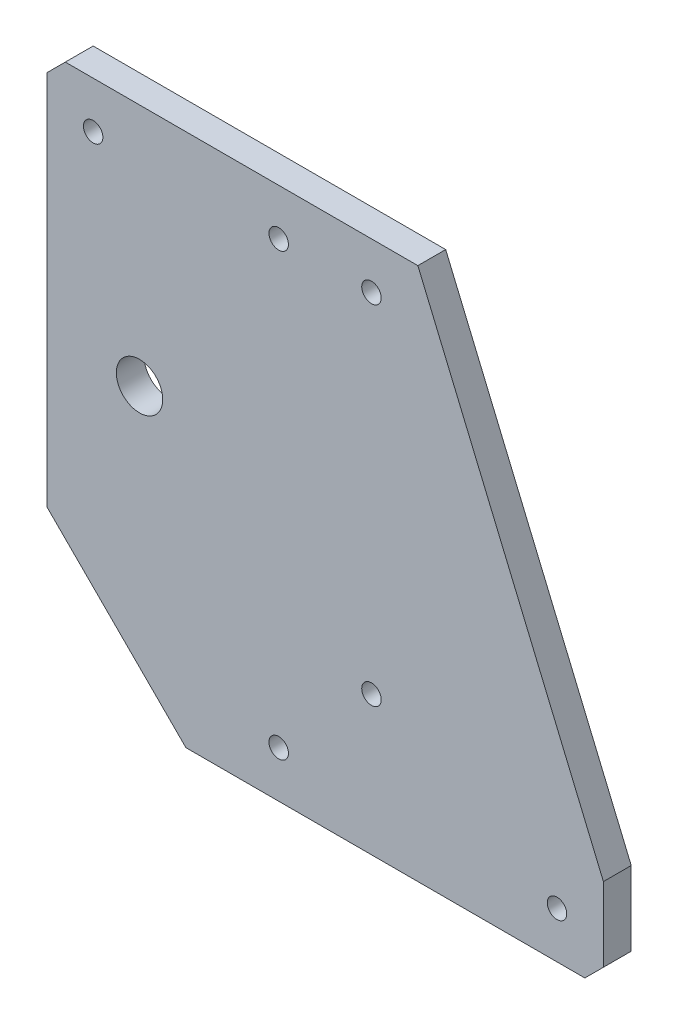
ISO-10303-21;
HEADER;
FILE_DESCRIPTION(('STEP AP214'),'2;1');
FILE_NAME('part.step','',(''),(''),'','','');
FILE_SCHEMA(('AUTOMOTIVE_DESIGN { 1 0 10303 214 1 1 1 1 }'));
ENDSEC;
DATA;
#1=APPLICATION_CONTEXT('core data for automotive mechanical design processes');
#2=APPLICATION_PROTOCOL_DEFINITION('international standard','automotive_design',2000,#1);
#3=PRODUCT_CONTEXT('',#1,'mechanical');
#4=PRODUCT('Part','Part','',(#3));
#5=PRODUCT_RELATED_PRODUCT_CATEGORY('part','',(#4));
#6=PRODUCT_DEFINITION_FORMATION('','',#4);
#7=PRODUCT_DEFINITION_CONTEXT('part definition',#1,'design');
#8=PRODUCT_DEFINITION('design','',#6,#7);
#9=PRODUCT_DEFINITION_SHAPE('','',#8);
#10=(LENGTH_UNIT() NAMED_UNIT(*) SI_UNIT(.MILLI.,.METRE.));
#11=(NAMED_UNIT(*) PLANE_ANGLE_UNIT() SI_UNIT($,.RADIAN.));
#12=(NAMED_UNIT(*) SI_UNIT($,.STERADIAN.) SOLID_ANGLE_UNIT());
#13=UNCERTAINTY_MEASURE_WITH_UNIT(LENGTH_MEASURE(1.E-05),#10,'distance_accuracy_value','');
#14=(GEOMETRIC_REPRESENTATION_CONTEXT(3) GLOBAL_UNCERTAINTY_ASSIGNED_CONTEXT((#13)) GLOBAL_UNIT_ASSIGNED_CONTEXT((#10,
#11,#12)) REPRESENTATION_CONTEXT('',''));
#15=CARTESIAN_POINT('',(0.,0.,0.));
#16=DIRECTION('',(0.,0.,1.));
#17=DIRECTION('',(1.,0.,0.));
#18=AXIS2_PLACEMENT_3D('',#15,#16,#17);
#19=CARTESIAN_POINT('',(0.,0.,3.));
#20=DIRECTION('',(0.,0.,1.));
#21=DIRECTION('',(1.,0.,0.));
#22=AXIS2_PLACEMENT_3D('',#19,#20,#21);
#23=PLANE('',#22);
#24=CARTESIAN_POINT('',(-10.,42.5,3.));
#25=DIRECTION('',(0.,0.,1.));
#26=DIRECTION('',(1.,0.,0.));
#27=AXIS2_PLACEMENT_3D('',#24,#25,#26);
#28=CIRCLE('',#27,2.1);
#29=CARTESIAN_POINT('',(-7.90000000000001,42.5,3.));
#30=VERTEX_POINT('',#29);
#31=EDGE_CURVE('E222',#30,#30,#28,.T.);
#32=ORIENTED_EDGE('',*,*,#31,.F.);
#33=EDGE_LOOP('',(#32));
#34=FACE_BOUND('',#33,.T.);
#35=CARTESIAN_POINT('',(30.,42.5,3.));
#36=DIRECTION('',(0.,0.,1.));
#37=DIRECTION('',(1.,0.,0.));
#38=AXIS2_PLACEMENT_3D('',#35,#36,#37);
#39=CIRCLE('',#38,2.1);
#40=CARTESIAN_POINT('',(32.1,42.5,3.));
#41=VERTEX_POINT('',#40);
#42=EDGE_CURVE('E305',#41,#41,#39,.T.);
#43=ORIENTED_EDGE('',*,*,#42,.F.);
#44=EDGE_LOOP('',(#43));
#45=FACE_BOUND('',#44,.T.);
#46=CARTESIAN_POINT('',(50.,42.5,3.));
#47=DIRECTION('',(0.,0.,1.));
#48=DIRECTION('',(1.,0.,0.));
#49=AXIS2_PLACEMENT_3D('',#46,#47,#48);
#50=CIRCLE('',#49,2.1);
#51=CARTESIAN_POINT('',(52.1,42.5,3.));
#52=VERTEX_POINT('',#51);
#53=EDGE_CURVE('E310',#52,#52,#50,.T.);
#54=ORIENTED_EDGE('',*,*,#53,.F.);
#55=EDGE_LOOP('',(#54));
#56=FACE_BOUND('',#55,.T.);
#57=CARTESIAN_POINT('',(50.,-32.5,3.));
#58=DIRECTION('',(0.,0.,1.));
#59=DIRECTION('',(1.,0.,0.));
#60=AXIS2_PLACEMENT_3D('',#57,#58,#59);
#61=CIRCLE('',#60,2.1);
#62=CARTESIAN_POINT('',(52.1,-32.5,3.));
#63=VERTEX_POINT('',#62);
#64=EDGE_CURVE('E313',#63,#63,#61,.T.);
#65=ORIENTED_EDGE('',*,*,#64,.F.);
#66=EDGE_LOOP('',(#65));
#67=FACE_BOUND('',#66,.T.);
#68=CARTESIAN_POINT('',(30.,-52.5,3.));
#69=DIRECTION('',(0.,0.,1.));
#70=DIRECTION('',(1.,0.,0.));
#71=AXIS2_PLACEMENT_3D('',#68,#69,#70);
#72=CIRCLE('',#71,2.1);
#73=CARTESIAN_POINT('',(32.1,-52.5,3.));
#74=VERTEX_POINT('',#73);
#75=EDGE_CURVE('E316',#74,#74,#72,.T.);
#76=ORIENTED_EDGE('',*,*,#75,.F.);
#77=EDGE_LOOP('',(#76));
#78=FACE_BOUND('',#77,.T.);
#79=CARTESIAN_POINT('',(90.,-52.5,3.));
#80=DIRECTION('',(0.,0.,1.));
#81=DIRECTION('',(1.,0.,0.));
#82=AXIS2_PLACEMENT_3D('',#79,#80,#81);
#83=CIRCLE('',#82,2.1);
#84=CARTESIAN_POINT('',(92.1,-52.5,3.));
#85=VERTEX_POINT('',#84);
#86=EDGE_CURVE('E318',#85,#85,#83,.T.);
#87=ORIENTED_EDGE('',*,*,#86,.F.);
#88=EDGE_LOOP('',(#87));
#89=FACE_BOUND('',#88,.T.);
#90=DIRECTION('',(-1.,0.,0.));
#91=VECTOR('',#90,1.);
#92=CARTESIAN_POINT('',(60.,52.5,3.));
#93=LINE('',#92,#91);
#94=CARTESIAN_POINT('',(60.,52.5,3.));
#95=VERTEX_POINT('',#94);
#96=CARTESIAN_POINT('',(-16.,52.5,3.));
#97=VERTEX_POINT('',#96);
#98=EDGE_CURVE('E141',#95,#97,#93,.T.);
#99=ORIENTED_EDGE('',*,*,#98,.T.);
#100=DIRECTION('',(0.707106781186548,0.707106781186548,0.));
#101=VECTOR('',#100,1.);
#102=CARTESIAN_POINT('',(-34.25,34.25,3.));
#103=LINE('',#102,#101);
#104=CARTESIAN_POINT('',(-20.,48.5,3.));
#105=VERTEX_POINT('',#104);
#106=EDGE_CURVE('E163',#97,#105,#103,.F.);
#107=ORIENTED_EDGE('',*,*,#106,.T.);
#108=DIRECTION('',(0.,-1.,0.));
#109=VECTOR('',#108,1.);
#110=CARTESIAN_POINT('',(-20.,52.5,3.));
#111=LINE('',#110,#109);
#112=CARTESIAN_POINT('',(-20.,-32.4999999999999,3.));
#113=VERTEX_POINT('',#112);
#114=EDGE_CURVE('E227',#105,#113,#111,.T.);
#115=ORIENTED_EDGE('',*,*,#114,.T.);
#116=DIRECTION('',(-0.707106781186547,0.707106781186548,0.));
#117=VECTOR('',#116,1.);
#118=CARTESIAN_POINT('',(-26.25,-26.2499999999999,3.));
#119=LINE('',#118,#117);
#120=CARTESIAN_POINT('',(10.,-62.5,3.));
#121=VERTEX_POINT('',#120);
#122=EDGE_CURVE('E151',#113,#121,#119,.F.);
#123=ORIENTED_EDGE('',*,*,#122,.T.);
#124=DIRECTION('',(1.,0.,0.));
#125=VECTOR('',#124,1.);
#126=CARTESIAN_POINT('',(-20.,-62.5,3.));
#127=LINE('',#126,#125);
#128=CARTESIAN_POINT('',(96.,-62.5,3.));
#129=VERTEX_POINT('',#128);
#130=EDGE_CURVE('E112',#121,#129,#127,.T.);
#131=ORIENTED_EDGE('',*,*,#130,.T.);
#132=DIRECTION('',(-0.707106781186548,-0.707106781186548,0.));
#133=VECTOR('',#132,1.);
#134=CARTESIAN_POINT('',(79.25,-79.25,3.));
#135=LINE('',#134,#133);
#136=CARTESIAN_POINT('',(100.,-58.5,3.));
#137=VERTEX_POINT('',#136);
#138=EDGE_CURVE('E53',#129,#137,#135,.F.);
#139=ORIENTED_EDGE('',*,*,#138,.T.);
#140=DIRECTION('',(0.,1.,0.));
#141=VECTOR('',#140,1.);
#142=CARTESIAN_POINT('',(100.,-62.5,3.));
#143=LINE('',#142,#141);
#144=CARTESIAN_POINT('',(100.,-42.5,3.));
#145=VERTEX_POINT('',#144);
#146=EDGE_CURVE('E102',#137,#145,#143,.T.);
#147=ORIENTED_EDGE('',*,*,#146,.T.);
#148=DIRECTION('',(-0.388057000058133,0.921635375138065,0.));
#149=VECTOR('',#148,1.);
#150=CARTESIAN_POINT('',(100.,-42.5,3.));
#151=LINE('',#150,#149);
#152=EDGE_CURVE('E107',#145,#95,#151,.T.);
#153=ORIENTED_EDGE('',*,*,#152,.T.);
#154=EDGE_LOOP('',(#99,#107,#115,#123,#131,#139,#147,#153));
#155=FACE_BOUND('',#154,.T.);
#156=CARTESIAN_POINT('',(0.,0.,3.));
#157=DIRECTION('',(0.,0.,1.));
#158=DIRECTION('',(1.,0.,0.));
#159=AXIS2_PLACEMENT_3D('',#156,#157,#158);
#160=CIRCLE('',#159,5.00000000000001);
#161=CARTESIAN_POINT('',(5.00000000000001,0.,3.));
#162=VERTEX_POINT('',#161);
#163=EDGE_CURVE('E135',#162,#162,#160,.T.);
#164=ORIENTED_EDGE('',*,*,#163,.F.);
#165=EDGE_LOOP('',(#164));
#166=FACE_BOUND('',#165,.T.);
#167=ADVANCED_FACE('F37',(#34,#45,#56,#67,#78,#89,#155,#166),#23,.T.);
#168=CARTESIAN_POINT('',(0.,0.,-3.));
#169=DIRECTION('',(0.,0.,1.));
#170=DIRECTION('',(1.,0.,0.));
#171=AXIS2_PLACEMENT_3D('',#168,#169,#170);
#172=PLANE('',#171);
#173=CARTESIAN_POINT('',(90.,-52.5,-3.));
#174=DIRECTION('',(0.,0.,1.));
#175=DIRECTION('',(1.,0.,0.));
#176=AXIS2_PLACEMENT_3D('',#173,#174,#175);
#177=CIRCLE('',#176,4.09999999999999);
#178=CARTESIAN_POINT('',(94.1,-52.5,-3.));
#179=VERTEX_POINT('',#178);
#180=EDGE_CURVE('E177',#179,#179,#177,.T.);
#181=ORIENTED_EDGE('',*,*,#180,.T.);
#182=EDGE_LOOP('',(#181));
#183=FACE_BOUND('',#182,.T.);
#184=CARTESIAN_POINT('',(30.,-52.5,-3.));
#185=DIRECTION('',(0.,0.,1.));
#186=DIRECTION('',(1.,0.,0.));
#187=AXIS2_PLACEMENT_3D('',#184,#185,#186);
#188=CIRCLE('',#187,4.10000000000001);
#189=CARTESIAN_POINT('',(34.1,-52.5,-3.));
#190=VERTEX_POINT('',#189);
#191=EDGE_CURVE('E174',#190,#190,#188,.T.);
#192=ORIENTED_EDGE('',*,*,#191,.T.);
#193=EDGE_LOOP('',(#192));
#194=FACE_BOUND('',#193,.T.);
#195=CARTESIAN_POINT('',(50.,-32.5,-3.));
#196=DIRECTION('',(0.,0.,1.));
#197=DIRECTION('',(1.,0.,0.));
#198=AXIS2_PLACEMENT_3D('',#195,#196,#197);
#199=CIRCLE('',#198,4.09999999999998);
#200=CARTESIAN_POINT('',(54.1,-32.5,-3.));
#201=VERTEX_POINT('',#200);
#202=EDGE_CURVE('E171',#201,#201,#199,.T.);
#203=ORIENTED_EDGE('',*,*,#202,.T.);
#204=EDGE_LOOP('',(#203));
#205=FACE_BOUND('',#204,.T.);
#206=CARTESIAN_POINT('',(50.,42.5,-3.));
#207=DIRECTION('',(0.,0.,1.));
#208=DIRECTION('',(1.,0.,0.));
#209=AXIS2_PLACEMENT_3D('',#206,#207,#208);
#210=CIRCLE('',#209,4.09999999999998);
#211=CARTESIAN_POINT('',(54.1,42.5,-3.));
#212=VERTEX_POINT('',#211);
#213=EDGE_CURVE('E168',#212,#212,#210,.T.);
#214=ORIENTED_EDGE('',*,*,#213,.T.);
#215=EDGE_LOOP('',(#214));
#216=FACE_BOUND('',#215,.T.);
#217=CARTESIAN_POINT('',(-10.,42.5,-3.));
#218=DIRECTION('',(0.,0.,1.));
#219=DIRECTION('',(1.,0.,0.));
#220=AXIS2_PLACEMENT_3D('',#217,#218,#219);
#221=CIRCLE('',#220,2.1);
#222=CARTESIAN_POINT('',(-7.90000000000001,42.5,-3.));
#223=VERTEX_POINT('',#222);
#224=EDGE_CURVE('E208',#223,#223,#221,.T.);
#225=ORIENTED_EDGE('',*,*,#224,.T.);
#226=EDGE_LOOP('',(#225));
#227=FACE_BOUND('',#226,.T.);
#228=CARTESIAN_POINT('',(30.,42.5,-3.));
#229=DIRECTION('',(0.,0.,1.));
#230=DIRECTION('',(1.,0.,0.));
#231=AXIS2_PLACEMENT_3D('',#228,#229,#230);
#232=CIRCLE('',#231,2.1);
#233=CARTESIAN_POINT('',(32.1,42.5,-3.));
#234=VERTEX_POINT('',#233);
#235=EDGE_CURVE('E212',#234,#234,#232,.T.);
#236=ORIENTED_EDGE('',*,*,#235,.T.);
#237=EDGE_LOOP('',(#236));
#238=FACE_BOUND('',#237,.T.);
#239=DIRECTION('',(0.,-1.,0.));
#240=VECTOR('',#239,1.);
#241=CARTESIAN_POINT('',(-20.,52.5,-3.));
#242=LINE('',#241,#240);
#243=CARTESIAN_POINT('',(-20.,48.5,-3.));
#244=VERTEX_POINT('',#243);
#245=CARTESIAN_POINT('',(-20.,-32.4999999999999,-3.));
#246=VERTEX_POINT('',#245);
#247=EDGE_CURVE('E134',#244,#246,#242,.T.);
#248=ORIENTED_EDGE('',*,*,#247,.F.);
#249=DIRECTION('',(-0.707106781186548,-0.707106781186548,0.));
#250=VECTOR('',#249,1.);
#251=CARTESIAN_POINT('',(-20.,48.5,-3.));
#252=LINE('',#251,#250);
#253=CARTESIAN_POINT('',(-16.,52.5,-3.));
#254=VERTEX_POINT('',#253);
#255=EDGE_CURVE('E158',#244,#254,#252,.F.);
#256=ORIENTED_EDGE('',*,*,#255,.T.);
#257=DIRECTION('',(-1.,0.,0.));
#258=VECTOR('',#257,1.);
#259=CARTESIAN_POINT('',(60.,52.5,-3.));
#260=LINE('',#259,#258);
#261=CARTESIAN_POINT('',(60.,52.5,-3.));
#262=VERTEX_POINT('',#261);
#263=EDGE_CURVE('E131',#262,#254,#260,.T.);
#264=ORIENTED_EDGE('',*,*,#263,.F.);
#265=DIRECTION('',(-0.388057000058133,0.921635375138065,0.));
#266=VECTOR('',#265,1.);
#267=CARTESIAN_POINT('',(100.,-42.5,-3.));
#268=LINE('',#267,#266);
#269=CARTESIAN_POINT('',(100.,-42.5,-3.));
#270=VERTEX_POINT('',#269);
#271=EDGE_CURVE('E140',#270,#262,#268,.T.);
#272=ORIENTED_EDGE('',*,*,#271,.F.);
#273=DIRECTION('',(0.,1.,0.));
#274=VECTOR('',#273,1.);
#275=CARTESIAN_POINT('',(100.,-62.5,-3.));
#276=LINE('',#275,#274);
#277=CARTESIAN_POINT('',(100.,-58.5,-3.));
#278=VERTEX_POINT('',#277);
#279=EDGE_CURVE('E118',#278,#270,#276,.T.);
#280=ORIENTED_EDGE('',*,*,#279,.F.);
#281=DIRECTION('',(0.707106781186548,0.707106781186548,0.));
#282=VECTOR('',#281,1.);
#283=CARTESIAN_POINT('',(100.,-58.5,-3.));
#284=LINE('',#283,#282);
#285=CARTESIAN_POINT('',(96.,-62.5,-3.));
#286=VERTEX_POINT('',#285);
#287=EDGE_CURVE('E156',#278,#286,#284,.F.);
#288=ORIENTED_EDGE('',*,*,#287,.T.);
#289=DIRECTION('',(1.,0.,0.));
#290=VECTOR('',#289,1.);
#291=CARTESIAN_POINT('',(-20.,-62.5,-3.));
#292=LINE('',#291,#290);
#293=CARTESIAN_POINT('',(10.,-62.5,-3.));
#294=VERTEX_POINT('',#293);
#295=EDGE_CURVE('E137',#294,#286,#292,.T.);
#296=ORIENTED_EDGE('',*,*,#295,.F.);
#297=DIRECTION('',(0.707106781186547,-0.707106781186548,0.));
#298=VECTOR('',#297,1.);
#299=CARTESIAN_POINT('',(10.,-62.5,-3.));
#300=LINE('',#299,#298);
#301=EDGE_CURVE('E145',#294,#246,#300,.F.);
#302=ORIENTED_EDGE('',*,*,#301,.T.);
#303=EDGE_LOOP('',(#248,#256,#264,#272,#280,#288,#296,#302));
#304=FACE_BOUND('',#303,.T.);
#305=CARTESIAN_POINT('',(0.,0.,-3.));
#306=DIRECTION('',(0.,0.,1.));
#307=DIRECTION('',(1.,0.,0.));
#308=AXIS2_PLACEMENT_3D('',#305,#306,#307);
#309=CIRCLE('',#308,5.00000000000001);
#310=CARTESIAN_POINT('',(5.00000000000001,0.,-3.));
#311=VERTEX_POINT('',#310);
#312=EDGE_CURVE('E217',#311,#311,#309,.T.);
#313=ORIENTED_EDGE('',*,*,#312,.T.);
#314=EDGE_LOOP('',(#313));
#315=FACE_BOUND('',#314,.T.);
#316=ADVANCED_FACE('F197',(#183,#194,#205,#216,#227,#238,#304,#315),#172,.F.);
#317=CARTESIAN_POINT('',(60.,52.5,3.));
#318=DIRECTION('',(0.,-1.,0.));
#319=DIRECTION('',(1.,0.,0.));
#320=AXIS2_PLACEMENT_3D('',#317,#318,#319);
#321=PLANE('',#320);
#322=ORIENTED_EDGE('',*,*,#263,.T.);
#323=DIRECTION('',(0.,0.,1.));
#324=VECTOR('',#323,1.);
#325=CARTESIAN_POINT('',(-16.,52.5,3.));
#326=LINE('',#325,#324);
#327=EDGE_CURVE('E160',#254,#97,#326,.T.);
#328=ORIENTED_EDGE('',*,*,#327,.T.);
#329=ORIENTED_EDGE('',*,*,#98,.F.);
#330=DIRECTION('',(0.,0.,-1.));
#331=VECTOR('',#330,1.);
#332=CARTESIAN_POINT('',(60.,52.5,3.));
#333=LINE('',#332,#331);
#334=EDGE_CURVE('E122',#95,#262,#333,.T.);
#335=ORIENTED_EDGE('',*,*,#334,.T.);
#336=EDGE_LOOP('',(#322,#328,#329,#335));
#337=FACE_BOUND('',#336,.T.);
#338=ADVANCED_FACE('F200',(#337),#321,.F.);
#339=CARTESIAN_POINT('',(-20.,52.5,3.));
#340=DIRECTION('',(1.,0.,0.));
#341=DIRECTION('',(0.,1.,0.));
#342=AXIS2_PLACEMENT_3D('',#339,#340,#341);
#343=PLANE('',#342);
#344=ORIENTED_EDGE('',*,*,#114,.F.);
#345=DIRECTION('',(0.,0.,-1.));
#346=VECTOR('',#345,1.);
#347=CARTESIAN_POINT('',(-20.,48.5,3.));
#348=LINE('',#347,#346);
#349=EDGE_CURVE('E153',#105,#244,#348,.T.);
#350=ORIENTED_EDGE('',*,*,#349,.T.);
#351=ORIENTED_EDGE('',*,*,#247,.T.);
#352=DIRECTION('',(0.,0.,1.));
#353=VECTOR('',#352,1.);
#354=CARTESIAN_POINT('',(-20.,-32.4999999999999,3.));
#355=LINE('',#354,#353);
#356=EDGE_CURVE('E148',#246,#113,#355,.T.);
#357=ORIENTED_EDGE('',*,*,#356,.T.);
#358=EDGE_LOOP('',(#344,#350,#351,#357));
#359=FACE_BOUND('',#358,.T.);
#360=ADVANCED_FACE('F242',(#359),#343,.F.);
#361=CARTESIAN_POINT('',(-20.,-62.5,3.));
#362=DIRECTION('',(0.,1.,0.));
#363=DIRECTION('',(0.,0.,1.));
#364=AXIS2_PLACEMENT_3D('',#361,#362,#363);
#365=PLANE('',#364);
#366=ORIENTED_EDGE('',*,*,#295,.T.);
#367=DIRECTION('',(0.,0.,1.));
#368=VECTOR('',#367,1.);
#369=CARTESIAN_POINT('',(96.,-62.5,3.));
#370=LINE('',#369,#368);
#371=EDGE_CURVE('E61',#286,#129,#370,.T.);
#372=ORIENTED_EDGE('',*,*,#371,.T.);
#373=ORIENTED_EDGE('',*,*,#130,.F.);
#374=DIRECTION('',(0.,0.,-1.));
#375=VECTOR('',#374,1.);
#376=CARTESIAN_POINT('',(10.,-62.5,3.));
#377=LINE('',#376,#375);
#378=EDGE_CURVE('E121',#121,#294,#377,.T.);
#379=ORIENTED_EDGE('',*,*,#378,.T.);
#380=EDGE_LOOP('',(#366,#372,#373,#379));
#381=FACE_BOUND('',#380,.T.);
#382=ADVANCED_FACE('F246',(#381),#365,.F.);
#383=CARTESIAN_POINT('',(100.,-62.5,3.));
#384=DIRECTION('',(-1.,0.,0.));
#385=DIRECTION('',(0.,0.,1.));
#386=AXIS2_PLACEMENT_3D('',#383,#384,#385);
#387=PLANE('',#386);
#388=ORIENTED_EDGE('',*,*,#146,.F.);
#389=DIRECTION('',(0.,0.,-1.));
#390=VECTOR('',#389,1.);
#391=CARTESIAN_POINT('',(100.,-58.5,3.));
#392=LINE('',#391,#390);
#393=EDGE_CURVE('E165',#137,#278,#392,.T.);
#394=ORIENTED_EDGE('',*,*,#393,.T.);
#395=ORIENTED_EDGE('',*,*,#279,.T.);
#396=DIRECTION('',(0.,0.,-1.));
#397=VECTOR('',#396,1.);
#398=CARTESIAN_POINT('',(100.,-42.5,3.));
#399=LINE('',#398,#397);
#400=EDGE_CURVE('E115',#145,#270,#399,.T.);
#401=ORIENTED_EDGE('',*,*,#400,.F.);
#402=EDGE_LOOP('',(#388,#394,#395,#401));
#403=FACE_BOUND('',#402,.T.);
#404=ADVANCED_FACE('F116',(#403),#387,.F.);
#405=CARTESIAN_POINT('',(100.,-42.5,3.));
#406=DIRECTION('',(-0.921635375138065,-0.388057000058133,0.));
#407=DIRECTION('',(0.388057000058133,-0.921635375138065,0.));
#408=AXIS2_PLACEMENT_3D('',#405,#406,#407);
#409=PLANE('',#408);
#410=ORIENTED_EDGE('',*,*,#271,.T.);
#411=ORIENTED_EDGE('',*,*,#334,.F.);
#412=ORIENTED_EDGE('',*,*,#152,.F.);
#413=ORIENTED_EDGE('',*,*,#400,.T.);
#414=EDGE_LOOP('',(#410,#411,#412,#413));
#415=FACE_BOUND('',#414,.T.);
#416=ADVANCED_FACE('F124',(#415),#409,.F.);
#417=CARTESIAN_POINT('',(0.,0.,3.));
#418=DIRECTION('',(0.,0.,-1.));
#419=DIRECTION('',(-1.,0.,0.));
#420=AXIS2_PLACEMENT_3D('',#417,#418,#419);
#421=CYLINDRICAL_SURFACE('',#420,5.00000000000001);
#422=ORIENTED_EDGE('',*,*,#163,.T.);
#423=EDGE_LOOP('',(#422));
#424=FACE_BOUND('',#423,.T.);
#425=ORIENTED_EDGE('',*,*,#312,.F.);
#426=EDGE_LOOP('',(#425));
#427=FACE_BOUND('',#426,.T.);
#428=ADVANCED_FACE('F263',(#424,#427),#421,.F.);
#429=CARTESIAN_POINT('',(90.,-52.5,-3.));
#430=DIRECTION('',(0.,0.,1.));
#431=DIRECTION('',(1.,0.,0.));
#432=AXIS2_PLACEMENT_3D('',#429,#430,#431);
#433=CYLINDRICAL_SURFACE('',#432,2.1);
#434=CARTESIAN_POINT('',(90.,-52.5,-0.999999999999993));
#435=DIRECTION('',(0.,0.,1.));
#436=DIRECTION('',(1.,0.,0.));
#437=AXIS2_PLACEMENT_3D('',#434,#435,#436);
#438=CIRCLE('',#437,2.1);
#439=CARTESIAN_POINT('',(92.1,-52.5,-0.999999999999993));
#440=VERTEX_POINT('',#439);
#441=EDGE_CURVE('E180',#440,#440,#438,.F.);
#442=ORIENTED_EDGE('',*,*,#441,.T.);
#443=EDGE_LOOP('',(#442));
#444=FACE_BOUND('',#443,.T.);
#445=ORIENTED_EDGE('',*,*,#86,.T.);
#446=EDGE_LOOP('',(#445));
#447=FACE_BOUND('',#446,.T.);
#448=ADVANCED_FACE('F270',(#444,#447),#433,.F.);
#449=CARTESIAN_POINT('',(30.,-52.5,-3.));
#450=DIRECTION('',(0.,0.,1.));
#451=DIRECTION('',(1.,0.,0.));
#452=AXIS2_PLACEMENT_3D('',#449,#450,#451);
#453=CYLINDRICAL_SURFACE('',#452,2.1);
#454=CARTESIAN_POINT('',(30.,-52.5,-0.999999999999984));
#455=DIRECTION('',(0.,0.,1.));
#456=DIRECTION('',(1.,0.,0.));
#457=AXIS2_PLACEMENT_3D('',#454,#455,#456);
#458=CIRCLE('',#457,2.1);
#459=CARTESIAN_POINT('',(32.1,-52.5,-0.999999999999984));
#460=VERTEX_POINT('',#459);
#461=EDGE_CURVE('E183',#460,#460,#458,.F.);
#462=ORIENTED_EDGE('',*,*,#461,.T.);
#463=EDGE_LOOP('',(#462));
#464=FACE_BOUND('',#463,.T.);
#465=ORIENTED_EDGE('',*,*,#75,.T.);
#466=EDGE_LOOP('',(#465));
#467=FACE_BOUND('',#466,.T.);
#468=ADVANCED_FACE('F275',(#464,#467),#453,.F.);
#469=CARTESIAN_POINT('',(50.,-32.5,-3.));
#470=DIRECTION('',(0.,0.,1.));
#471=DIRECTION('',(1.,0.,0.));
#472=AXIS2_PLACEMENT_3D('',#469,#470,#471);
#473=CYLINDRICAL_SURFACE('',#472,2.1);
#474=CARTESIAN_POINT('',(50.,-32.5,-1.00000000000003));
#475=DIRECTION('',(0.,0.,1.));
#476=DIRECTION('',(1.,0.,0.));
#477=AXIS2_PLACEMENT_3D('',#474,#475,#476);
#478=CIRCLE('',#477,2.1);
#479=CARTESIAN_POINT('',(52.1,-32.5,-1.00000000000003));
#480=VERTEX_POINT('',#479);
#481=EDGE_CURVE('E46',#480,#480,#478,.F.);
#482=ORIENTED_EDGE('',*,*,#481,.T.);
#483=EDGE_LOOP('',(#482));
#484=FACE_BOUND('',#483,.T.);
#485=ORIENTED_EDGE('',*,*,#64,.T.);
#486=EDGE_LOOP('',(#485));
#487=FACE_BOUND('',#486,.T.);
#488=ADVANCED_FACE('F188',(#484,#487),#473,.F.);
#489=CARTESIAN_POINT('',(50.,42.5,-3.));
#490=DIRECTION('',(0.,0.,1.));
#491=DIRECTION('',(1.,0.,0.));
#492=AXIS2_PLACEMENT_3D('',#489,#490,#491);
#493=CYLINDRICAL_SURFACE('',#492,2.1);
#494=CARTESIAN_POINT('',(50.,42.5,-1.00000000000003));
#495=DIRECTION('',(0.,0.,1.));
#496=DIRECTION('',(1.,0.,0.));
#497=AXIS2_PLACEMENT_3D('',#494,#495,#496);
#498=CIRCLE('',#497,2.1);
#499=CARTESIAN_POINT('',(52.1,42.5,-1.00000000000003));
#500=VERTEX_POINT('',#499);
#501=EDGE_CURVE('E11',#500,#500,#498,.F.);
#502=ORIENTED_EDGE('',*,*,#501,.T.);
#503=EDGE_LOOP('',(#502));
#504=FACE_BOUND('',#503,.T.);
#505=ORIENTED_EDGE('',*,*,#53,.T.);
#506=EDGE_LOOP('',(#505));
#507=FACE_BOUND('',#506,.T.);
#508=ADVANCED_FACE('F287',(#504,#507),#493,.F.);
#509=CARTESIAN_POINT('',(30.,42.5,-3.));
#510=DIRECTION('',(0.,0.,1.));
#511=DIRECTION('',(1.,0.,0.));
#512=AXIS2_PLACEMENT_3D('',#509,#510,#511);
#513=CYLINDRICAL_SURFACE('',#512,2.1);
#514=ORIENTED_EDGE('',*,*,#235,.F.);
#515=EDGE_LOOP('',(#514));
#516=FACE_BOUND('',#515,.T.);
#517=ORIENTED_EDGE('',*,*,#42,.T.);
#518=EDGE_LOOP('',(#517));
#519=FACE_BOUND('',#518,.T.);
#520=ADVANCED_FACE('F290',(#516,#519),#513,.F.);
#521=CARTESIAN_POINT('',(-10.,42.5,-3.));
#522=DIRECTION('',(0.,0.,1.));
#523=DIRECTION('',(1.,0.,0.));
#524=AXIS2_PLACEMENT_3D('',#521,#522,#523);
#525=CYLINDRICAL_SURFACE('',#524,2.1);
#526=ORIENTED_EDGE('',*,*,#224,.F.);
#527=EDGE_LOOP('',(#526));
#528=FACE_BOUND('',#527,.T.);
#529=ORIENTED_EDGE('',*,*,#31,.T.);
#530=EDGE_LOOP('',(#529));
#531=FACE_BOUND('',#530,.T.);
#532=ADVANCED_FACE('F294',(#528,#531),#525,.F.);
#533=CARTESIAN_POINT('',(10.,-62.5,3.));
#534=DIRECTION('',(0.707106781186548,0.707106781186547,0.));
#535=DIRECTION('',(0.,0.,-1.));
#536=AXIS2_PLACEMENT_3D('',#533,#534,#535);
#537=PLANE('',#536);
#538=ORIENTED_EDGE('',*,*,#122,.F.);
#539=ORIENTED_EDGE('',*,*,#356,.F.);
#540=ORIENTED_EDGE('',*,*,#301,.F.);
#541=ORIENTED_EDGE('',*,*,#378,.F.);
#542=EDGE_LOOP('',(#538,#539,#540,#541));
#543=FACE_BOUND('',#542,.T.);
#544=ADVANCED_FACE('F245',(#543),#537,.F.);
#545=CARTESIAN_POINT('',(-20.,48.5,3.));
#546=DIRECTION('',(0.707106781186548,-0.707106781186548,0.));
#547=DIRECTION('',(0.,0.,-1.));
#548=AXIS2_PLACEMENT_3D('',#545,#546,#547);
#549=PLANE('',#548);
#550=ORIENTED_EDGE('',*,*,#106,.F.);
#551=ORIENTED_EDGE('',*,*,#327,.F.);
#552=ORIENTED_EDGE('',*,*,#255,.F.);
#553=ORIENTED_EDGE('',*,*,#349,.F.);
#554=EDGE_LOOP('',(#550,#551,#552,#553));
#555=FACE_BOUND('',#554,.T.);
#556=ADVANCED_FACE('F240',(#555),#549,.F.);
#557=CARTESIAN_POINT('',(100.,-58.5,3.));
#558=DIRECTION('',(-0.707106781186547,0.707106781186547,0.));
#559=DIRECTION('',(0.,0.,-1.));
#560=AXIS2_PLACEMENT_3D('',#557,#558,#559);
#561=PLANE('',#560);
#562=ORIENTED_EDGE('',*,*,#138,.F.);
#563=ORIENTED_EDGE('',*,*,#371,.F.);
#564=ORIENTED_EDGE('',*,*,#287,.F.);
#565=ORIENTED_EDGE('',*,*,#393,.F.);
#566=EDGE_LOOP('',(#562,#563,#564,#565));
#567=FACE_BOUND('',#566,.T.);
#568=ADVANCED_FACE('F231',(#567),#561,.F.);
#569=CARTESIAN_POINT('',(90.,-52.5,-3.));
#570=DIRECTION('',(0.,0.,-1.));
#571=DIRECTION('',(-1.,0.,0.));
#572=AXIS2_PLACEMENT_3D('',#569,#570,#571);
#573=CONICAL_SURFACE('',#572,4.09999999999999,0.785398163397443);
#574=ORIENTED_EDGE('',*,*,#441,.F.);
#575=EDGE_LOOP('',(#574));
#576=FACE_BOUND('',#575,.T.);
#577=ORIENTED_EDGE('',*,*,#180,.F.);
#578=EDGE_LOOP('',(#577));
#579=FACE_BOUND('',#578,.T.);
#580=ADVANCED_FACE('F350',(#576,#579),#573,.F.);
#581=CARTESIAN_POINT('',(30.,-52.5,-3.));
#582=DIRECTION('',(0.,0.,-1.));
#583=DIRECTION('',(-1.,0.,0.));
#584=AXIS2_PLACEMENT_3D('',#581,#582,#583);
#585=CONICAL_SURFACE('',#584,4.10000000000001,0.785398163397447);
#586=ORIENTED_EDGE('',*,*,#461,.F.);
#587=EDGE_LOOP('',(#586));
#588=FACE_BOUND('',#587,.T.);
#589=ORIENTED_EDGE('',*,*,#191,.F.);
#590=EDGE_LOOP('',(#589));
#591=FACE_BOUND('',#590,.T.);
#592=ADVANCED_FACE('F194',(#588,#591),#585,.F.);
#593=CARTESIAN_POINT('',(50.,-32.5,-3.));
#594=DIRECTION('',(0.,0.,-1.));
#595=DIRECTION('',(-1.,0.,0.));
#596=AXIS2_PLACEMENT_3D('',#593,#594,#595);
#597=CONICAL_SURFACE('',#596,4.09999999999998,0.78539816339745);
#598=ORIENTED_EDGE('',*,*,#481,.F.);
#599=EDGE_LOOP('',(#598));
#600=FACE_BOUND('',#599,.T.);
#601=ORIENTED_EDGE('',*,*,#202,.F.);
#602=EDGE_LOOP('',(#601));
#603=FACE_BOUND('',#602,.T.);
#604=ADVANCED_FACE('F191',(#600,#603),#597,.F.);
#605=CARTESIAN_POINT('',(50.,42.5,-3.));
#606=DIRECTION('',(0.,0.,-1.));
#607=DIRECTION('',(-1.,0.,0.));
#608=AXIS2_PLACEMENT_3D('',#605,#606,#607);
#609=CONICAL_SURFACE('',#608,4.09999999999998,0.78539816339745);
#610=ORIENTED_EDGE('',*,*,#501,.F.);
#611=EDGE_LOOP('',(#610));
#612=FACE_BOUND('',#611,.T.);
#613=ORIENTED_EDGE('',*,*,#213,.F.);
#614=EDGE_LOOP('',(#613));
#615=FACE_BOUND('',#614,.T.);
#616=ADVANCED_FACE('F40',(#612,#615),#609,.F.);
#617=CLOSED_SHELL('',(#167,#316,#338,#360,#382,#404,#416,#428,#448,#468,#488,#508,#520,#532,
#544,#556,#568,#580,#592,#604,#616));
#618=MANIFOLD_SOLID_BREP('B2',#617);
#619=ADVANCED_BREP_SHAPE_REPRESENTATION('',(#18,#618),#14);
#620=SHAPE_DEFINITION_REPRESENTATION(#9,#619);
ENDSEC;
END-ISO-10303-21;
